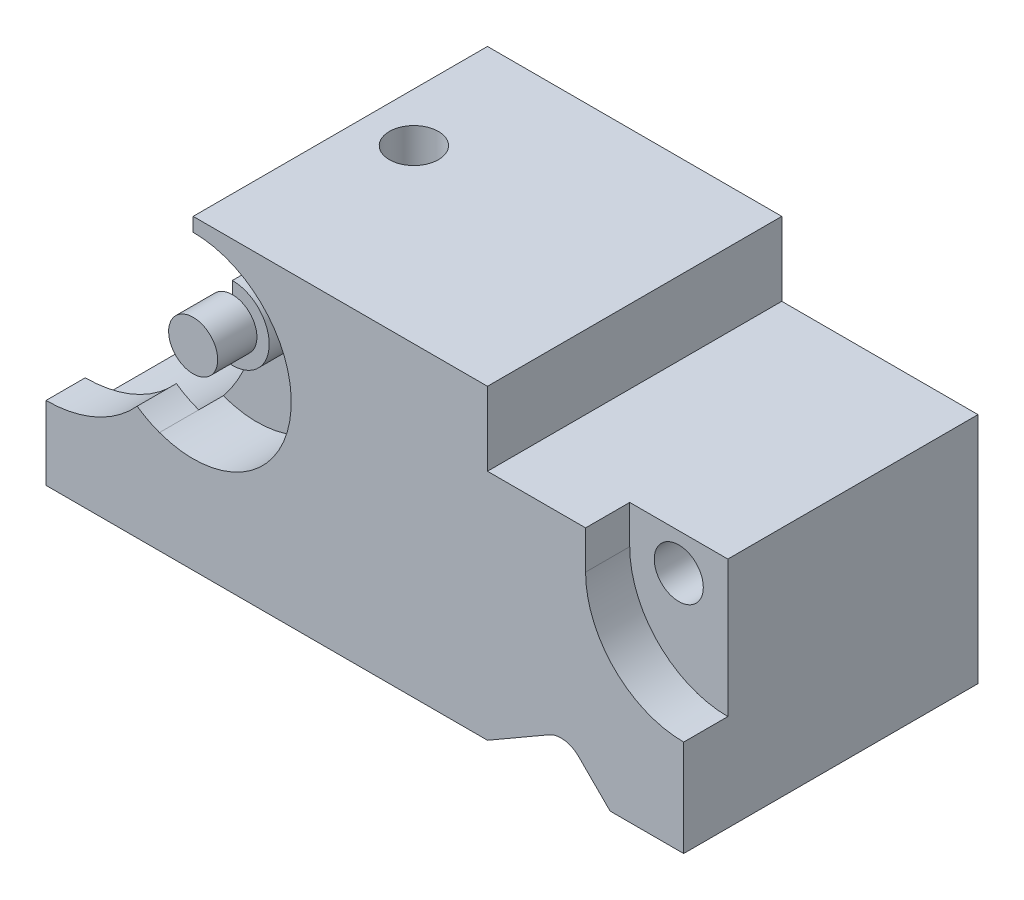
ISO-10303-21;
HEADER;
FILE_DESCRIPTION(('STEP AP214'),'2;1');
FILE_NAME('part.step','',(''),(''),'','','');
FILE_SCHEMA(('AUTOMOTIVE_DESIGN { 1 0 10303 214 1 1 1 1 }'));
ENDSEC;
DATA;
#1=APPLICATION_CONTEXT('core data for automotive mechanical design processes');
#2=APPLICATION_PROTOCOL_DEFINITION('international standard','automotive_design',2000,#1);
#3=PRODUCT_CONTEXT('',#1,'mechanical');
#4=PRODUCT('Part','Part','',(#3));
#5=PRODUCT_RELATED_PRODUCT_CATEGORY('part','',(#4));
#6=PRODUCT_DEFINITION_FORMATION('','',#4);
#7=PRODUCT_DEFINITION_CONTEXT('part definition',#1,'design');
#8=PRODUCT_DEFINITION('design','',#6,#7);
#9=PRODUCT_DEFINITION_SHAPE('','',#8);
#10=(LENGTH_UNIT() NAMED_UNIT(*) SI_UNIT(.MILLI.,.METRE.));
#11=(NAMED_UNIT(*) PLANE_ANGLE_UNIT() SI_UNIT($,.RADIAN.));
#12=(NAMED_UNIT(*) SI_UNIT($,.STERADIAN.) SOLID_ANGLE_UNIT());
#13=UNCERTAINTY_MEASURE_WITH_UNIT(LENGTH_MEASURE(1.E-05),#10,'distance_accuracy_value','');
#14=(GEOMETRIC_REPRESENTATION_CONTEXT(3) GLOBAL_UNCERTAINTY_ASSIGNED_CONTEXT((#13)) GLOBAL_UNIT_ASSIGNED_CONTEXT((#10,
#11,#12)) REPRESENTATION_CONTEXT('',''));
#15=CARTESIAN_POINT('',(0.,0.,0.));
#16=DIRECTION('',(0.,0.,1.));
#17=DIRECTION('',(1.,0.,0.));
#18=AXIS2_PLACEMENT_3D('',#15,#16,#17);
#19=CARTESIAN_POINT('',(-65.,0.,-30.));
#20=DIRECTION('',(0.,-1.,0.));
#21=DIRECTION('',(1.,0.,0.));
#22=AXIS2_PLACEMENT_3D('',#19,#20,#21);
#23=PLANE('',#22);
#24=DIRECTION('',(0.,0.,1.));
#25=VECTOR('',#24,1.);
#26=CARTESIAN_POINT('',(25.,0.,-30.));
#27=LINE('',#26,#25);
#28=CARTESIAN_POINT('',(25.,0.,-30.));
#29=VERTEX_POINT('',#28);
#30=CARTESIAN_POINT('',(25.,0.,30.));
#31=VERTEX_POINT('',#30);
#32=EDGE_CURVE('E193',#29,#31,#27,.T.);
#33=ORIENTED_EDGE('',*,*,#32,.T.);
#34=DIRECTION('',(1.,0.,0.));
#35=VECTOR('',#34,1.);
#36=CARTESIAN_POINT('',(-65.,0.,30.));
#37=LINE('',#36,#35);
#38=CARTESIAN_POINT('',(-65.,0.,30.));
#39=VERTEX_POINT('',#38);
#40=EDGE_CURVE('E301',#39,#31,#37,.T.);
#41=ORIENTED_EDGE('',*,*,#40,.F.);
#42=DIRECTION('',(0.,0.,1.));
#43=VECTOR('',#42,1.);
#44=CARTESIAN_POINT('',(-65.,0.,-30.));
#45=LINE('',#44,#43);
#46=CARTESIAN_POINT('',(-65.,0.,-30.));
#47=VERTEX_POINT('',#46);
#48=EDGE_CURVE('E219',#47,#39,#45,.T.);
#49=ORIENTED_EDGE('',*,*,#48,.F.);
#50=DIRECTION('',(1.,0.,0.));
#51=VECTOR('',#50,1.);
#52=CARTESIAN_POINT('',(-65.,0.,-30.));
#53=LINE('',#52,#51);
#54=EDGE_CURVE('E211',#47,#29,#53,.T.);
#55=ORIENTED_EDGE('',*,*,#54,.T.);
#56=EDGE_LOOP('',(#33,#41,#49,#55));
#57=FACE_BOUND('',#56,.T.);
#58=CARTESIAN_POINT('',(-25.,0.,-5.));
#59=DIRECTION('',(0.,1.,0.));
#60=DIRECTION('',(-1.,0.,0.));
#61=AXIS2_PLACEMENT_3D('',#58,#59,#60);
#62=CIRCLE('',#61,5.);
#63=CARTESIAN_POINT('',(-30.,0.,-5.));
#64=VERTEX_POINT('',#63);
#65=EDGE_CURVE('E402',#64,#64,#62,.T.);
#66=ORIENTED_EDGE('',*,*,#65,.T.);
#67=EDGE_LOOP('',(#66));
#68=FACE_BOUND('',#67,.T.);
#69=ADVANCED_FACE('F33',(#57,#68),#23,.T.);
#70=CARTESIAN_POINT('',(-35.0000000000001,39.6862696659606,17.));
#71=DIRECTION('',(0.,0.,1.));
#72=DIRECTION('',(1.,0.,0.));
#73=AXIS2_PLACEMENT_3D('',#70,#71,#72);
#74=PLANE('',#73);
#75=CARTESIAN_POINT('',(-35.,39.6862696659606,17.));
#76=DIRECTION('',(0.,0.,1.));
#77=DIRECTION('',(1.,0.,0.));
#78=AXIS2_PLACEMENT_3D('',#75,#76,#77);
#79=CIRCLE('',#78,7.5);
#80=CARTESIAN_POINT('',(-35.9374999999997,32.2450941035914,17.));
#81=VERTEX_POINT('',#80);
#82=CARTESIAN_POINT('',(-35.,47.1862696659606,17.));
#83=VERTEX_POINT('',#82);
#84=EDGE_CURVE('E358',#81,#83,#79,.T.);
#85=ORIENTED_EDGE('',*,*,#84,.F.);
#86=CARTESIAN_POINT('',(-64.9999999999997,39.6862696659606,17.));
#87=DIRECTION('',(0.,0.,-1.));
#88=DIRECTION('',(1.,0.,0.));
#89=AXIS2_PLACEMENT_3D('',#86,#87,#88);
#90=CIRCLE('',#89,29.9999999999998);
#91=CARTESIAN_POINT('',(-35.,39.6862696659606,17.));
#92=VERTEX_POINT('',#91);
#93=EDGE_CURVE('E361',#92,#81,#90,.T.);
#94=ORIENTED_EDGE('',*,*,#93,.F.);
#95=CARTESIAN_POINT('',(-65.,40.,17.));
#96=DIRECTION('',(0.,0.,1.));
#97=DIRECTION('',(1.,0.,0.));
#98=AXIS2_PLACEMENT_3D('',#95,#96,#97);
#99=CIRCLE('',#98,30.0016404005263);
#100=CARTESIAN_POINT('',(-41.8631200890134,20.9007011985497,17.));
#101=VERTEX_POINT('',#100);
#102=EDGE_CURVE('E288',#101,#92,#99,.T.);
#103=ORIENTED_EDGE('',*,*,#102,.F.);
#104=CARTESIAN_POINT('',(-35.0000000000001,39.6862696659606,17.));
#105=DIRECTION('',(0.,0.,1.));
#106=DIRECTION('',(1.,0.,0.));
#107=AXIS2_PLACEMENT_3D('',#104,#105,#106);
#108=CIRCLE('',#107,20.);
#109=CARTESIAN_POINT('',(-35.0000000000001,59.6862696659606,17.));
#110=VERTEX_POINT('',#109);
#111=EDGE_CURVE('E284',#101,#110,#108,.T.);
#112=ORIENTED_EDGE('',*,*,#111,.T.);
#113=DIRECTION('',(0.,1.,0.));
#114=VECTOR('',#113,1.);
#115=CARTESIAN_POINT('',(-35.,62.5,17.));
#116=LINE('',#115,#114);
#117=EDGE_CURVE('E41',#83,#110,#116,.T.);
#118=ORIENTED_EDGE('',*,*,#117,.F.);
#119=EDGE_LOOP('',(#85,#94,#103,#112,#118));
#120=FACE_BOUND('',#119,.T.);
#121=ADVANCED_FACE('F285',(#120),#74,.T.);
#122=DIRECTION('',(0.,0.,1.));
#123=VECTOR('',#122,1.);
#124=CARTESIAN_POINT('',(50.,0.,-30.));
#125=LINE('',#124,#123);
#126=CARTESIAN_POINT('',(50.,0.,-30.));
#127=VERTEX_POINT('',#126);
#128=CARTESIAN_POINT('',(50.,0.,30.));
#129=VERTEX_POINT('',#128);
#130=EDGE_CURVE('E48',#127,#129,#125,.T.);
#131=ORIENTED_EDGE('',*,*,#130,.F.);
#132=CARTESIAN_POINT('',(65.,0.,-30.));
#133=VERTEX_POINT('',#132);
#134=EDGE_CURVE('E221',#127,#133,#53,.T.);
#135=ORIENTED_EDGE('',*,*,#134,.T.);
#136=DIRECTION('',(0.,0.,1.));
#137=VECTOR('',#136,1.);
#138=CARTESIAN_POINT('',(65.,0.,-30.));
#139=LINE('',#138,#137);
#140=CARTESIAN_POINT('',(65.,0.,30.));
#141=VERTEX_POINT('',#140);
#142=EDGE_CURVE('E246',#133,#141,#139,.T.);
#143=ORIENTED_EDGE('',*,*,#142,.T.);
#144=EDGE_CURVE('E300',#129,#141,#37,.T.);
#145=ORIENTED_EDGE('',*,*,#144,.F.);
#146=EDGE_LOOP('',(#131,#135,#143,#145));
#147=FACE_BOUND('',#146,.T.);
#148=ADVANCED_FACE('F35',(#147),#23,.T.);
#149=CARTESIAN_POINT('',(-65.,9.99835959947371,-30.));
#150=DIRECTION('',(-1.,0.,0.));
#151=DIRECTION('',(0.,0.,1.));
#152=AXIS2_PLACEMENT_3D('',#149,#150,#151);
#153=PLANE('',#152);
#154=ORIENTED_EDGE('',*,*,#48,.T.);
#155=DIRECTION('',(0.,-1.,0.));
#156=VECTOR('',#155,1.);
#157=CARTESIAN_POINT('',(-65.,9.99835959947371,30.));
#158=LINE('',#157,#156);
#159=CARTESIAN_POINT('',(-64.9999999999997,15.,30.));
#160=VERTEX_POINT('',#159);
#161=EDGE_CURVE('E226',#160,#39,#158,.T.);
#162=ORIENTED_EDGE('',*,*,#161,.F.);
#163=DIRECTION('',(0.,0.,1.));
#164=VECTOR('',#163,1.);
#165=CARTESIAN_POINT('',(-64.9999999999997,15.,22.));
#166=LINE('',#165,#164);
#167=CARTESIAN_POINT('',(-64.9999999999997,15.,22.));
#168=VERTEX_POINT('',#167);
#169=EDGE_CURVE('E328',#168,#160,#166,.T.);
#170=ORIENTED_EDGE('',*,*,#169,.F.);
#171=DIRECTION('',(0.,-1.,0.));
#172=VECTOR('',#171,1.);
#173=CARTESIAN_POINT('',(-65.,9.99835959947371,22.));
#174=LINE('',#173,#172);
#175=CARTESIAN_POINT('',(-65.,9.99835959947371,22.));
#176=VERTEX_POINT('',#175);
#177=EDGE_CURVE('E348',#168,#176,#174,.T.);
#178=ORIENTED_EDGE('',*,*,#177,.T.);
#179=DIRECTION('',(0.,0.,1.));
#180=VECTOR('',#179,1.);
#181=CARTESIAN_POINT('',(-65.,9.99835959947371,-30.));
#182=LINE('',#181,#180);
#183=CARTESIAN_POINT('',(-65.,9.99835959947371,-30.));
#184=VERTEX_POINT('',#183);
#185=EDGE_CURVE('E249',#184,#176,#182,.T.);
#186=ORIENTED_EDGE('',*,*,#185,.F.);
#187=DIRECTION('',(0.,-1.,0.));
#188=VECTOR('',#187,1.);
#189=CARTESIAN_POINT('',(-65.,9.99835959947371,-30.));
#190=LINE('',#189,#188);
#191=EDGE_CURVE('E244',#184,#47,#190,.T.);
#192=ORIENTED_EDGE('',*,*,#191,.T.);
#193=EDGE_LOOP('',(#154,#162,#170,#178,#186,#192));
#194=FACE_BOUND('',#193,.T.);
#195=ADVANCED_FACE('F327',(#194),#153,.T.);
#196=CARTESIAN_POINT('',(-65.,40.,-30.));
#197=DIRECTION('',(0.,0.,1.));
#198=DIRECTION('',(1.,0.,0.));
#199=AXIS2_PLACEMENT_3D('',#196,#197,#198);
#200=CYLINDRICAL_SURFACE('',#199,30.0016404005263);
#201=DIRECTION('',(0.,0.,1.));
#202=VECTOR('',#201,1.);
#203=CARTESIAN_POINT('',(-41.8634892542629,20.9002540007757,22.));
#204=LINE('',#203,#202);
#205=CARTESIAN_POINT('',(-41.8634892542629,20.9002540007757,22.));
#206=VERTEX_POINT('',#205);
#207=CARTESIAN_POINT('',(-41.8634892542629,20.9002540007757,30.));
#208=VERTEX_POINT('',#207);
#209=EDGE_CURVE('E291',#206,#208,#204,.T.);
#210=ORIENTED_EDGE('',*,*,#209,.T.);
#211=CARTESIAN_POINT('',(-65.,40.,30.));
#212=DIRECTION('',(0.,0.,-1.));
#213=DIRECTION('',(-1.,0.,0.));
#214=AXIS2_PLACEMENT_3D('',#211,#212,#213);
#215=CIRCLE('',#214,30.0016404005263);
#216=CARTESIAN_POINT('',(-41.8631200890134,20.9007011985497,30.));
#217=VERTEX_POINT('',#216);
#218=EDGE_CURVE('E315',#217,#208,#215,.T.);
#219=ORIENTED_EDGE('',*,*,#218,.F.);
#220=DIRECTION('',(0.,0.,1.));
#221=VECTOR('',#220,1.);
#222=CARTESIAN_POINT('',(-41.8631200890134,20.9007011985497,23.5));
#223=LINE('',#222,#221);
#224=EDGE_CURVE('E294',#101,#217,#223,.T.);
#225=ORIENTED_EDGE('',*,*,#224,.F.);
#226=ORIENTED_EDGE('',*,*,#102,.T.);
#227=DIRECTION('',(0.,0.,1.));
#228=VECTOR('',#227,1.);
#229=CARTESIAN_POINT('',(-35.0000000000001,39.6862696659606,-30.));
#230=LINE('',#229,#228);
#231=CARTESIAN_POINT('',(-35.0000000000001,39.6862696659606,-30.));
#232=VERTEX_POINT('',#231);
#233=EDGE_CURVE('E252',#232,#92,#230,.T.);
#234=ORIENTED_EDGE('',*,*,#233,.F.);
#235=CARTESIAN_POINT('',(-65.,40.,-30.));
#236=DIRECTION('',(0.,0.,-1.));
#237=DIRECTION('',(-1.,0.,0.));
#238=AXIS2_PLACEMENT_3D('',#235,#236,#237);
#239=CIRCLE('',#238,30.0016404005263);
#240=EDGE_CURVE('E241',#232,#184,#239,.T.);
#241=ORIENTED_EDGE('',*,*,#240,.T.);
#242=ORIENTED_EDGE('',*,*,#185,.T.);
#243=CARTESIAN_POINT('',(-65.,40.,22.));
#244=DIRECTION('',(0.,0.,1.));
#245=DIRECTION('',(1.,0.,0.));
#246=AXIS2_PLACEMENT_3D('',#243,#244,#245);
#247=CIRCLE('',#246,30.0016404005263);
#248=EDGE_CURVE('E339',#176,#206,#247,.T.);
#249=ORIENTED_EDGE('',*,*,#248,.T.);
#250=EDGE_LOOP('',(#210,#219,#225,#226,#234,#241,#242,#249));
#251=FACE_BOUND('',#250,.T.);
#252=ADVANCED_FACE('F450',(#251),#200,.F.);
#253=CARTESIAN_POINT('',(-35.,62.5,-30.));
#254=DIRECTION('',(-1.,0.,0.));
#255=DIRECTION('',(0.,0.,1.));
#256=AXIS2_PLACEMENT_3D('',#253,#254,#255);
#257=PLANE('',#256);
#258=DIRECTION('',(0.,0.,1.));
#259=VECTOR('',#258,1.);
#260=CARTESIAN_POINT('',(-35.0000000000001,59.6862696659606,17.));
#261=LINE('',#260,#259);
#262=CARTESIAN_POINT('',(-35.0000000000001,59.6862696659606,30.));
#263=VERTEX_POINT('',#262);
#264=EDGE_CURVE('E275',#110,#263,#261,.T.);
#265=ORIENTED_EDGE('',*,*,#264,.T.);
#266=DIRECTION('',(0.,-1.,0.));
#267=VECTOR('',#266,1.);
#268=CARTESIAN_POINT('',(-35.,62.5,30.));
#269=LINE('',#268,#267);
#270=CARTESIAN_POINT('',(-35.,62.5,30.));
#271=VERTEX_POINT('',#270);
#272=EDGE_CURVE('E314',#271,#263,#269,.T.);
#273=ORIENTED_EDGE('',*,*,#272,.F.);
#274=DIRECTION('',(0.,0.,1.));
#275=VECTOR('',#274,1.);
#276=CARTESIAN_POINT('',(-35.,62.5,-30.));
#277=LINE('',#276,#275);
#278=CARTESIAN_POINT('',(-35.,62.5,-30.));
#279=VERTEX_POINT('',#278);
#280=EDGE_CURVE('E255',#279,#271,#277,.T.);
#281=ORIENTED_EDGE('',*,*,#280,.F.);
#282=DIRECTION('',(0.,-1.,0.));
#283=VECTOR('',#282,1.);
#284=CARTESIAN_POINT('',(-35.,62.5,-30.));
#285=LINE('',#284,#283);
#286=EDGE_CURVE('E238',#279,#232,#285,.T.);
#287=ORIENTED_EDGE('',*,*,#286,.T.);
#288=ORIENTED_EDGE('',*,*,#233,.T.);
#289=DIRECTION('',(0.,0.,-1.));
#290=VECTOR('',#289,1.);
#291=CARTESIAN_POINT('',(-35.,39.6862696659606,22.));
#292=LINE('',#291,#290);
#293=CARTESIAN_POINT('',(-34.9999999999999,39.6862696659606,22.));
#294=VERTEX_POINT('',#293);
#295=EDGE_CURVE('E355',#294,#92,#292,.T.);
#296=ORIENTED_EDGE('',*,*,#295,.F.);
#297=DIRECTION('',(0.,-1.,0.));
#298=VECTOR('',#297,1.);
#299=CARTESIAN_POINT('',(-35.,47.1862696659606,22.));
#300=LINE('',#299,#298);
#301=CARTESIAN_POINT('',(-35.,44.6862696659606,22.));
#302=VERTEX_POINT('',#301);
#303=EDGE_CURVE('E367',#302,#294,#300,.T.);
#304=ORIENTED_EDGE('',*,*,#303,.F.);
#305=CARTESIAN_POINT('',(-35.,47.1862696659606,22.));
#306=VERTEX_POINT('',#305);
#307=EDGE_CURVE('E357',#306,#302,#300,.T.);
#308=ORIENTED_EDGE('',*,*,#307,.F.);
#309=DIRECTION('',(0.,0.,-1.));
#310=VECTOR('',#309,1.);
#311=CARTESIAN_POINT('',(-35.,47.1862696659606,22.));
#312=LINE('',#311,#310);
#313=EDGE_CURVE('E279',#306,#83,#312,.T.);
#314=ORIENTED_EDGE('',*,*,#313,.T.);
#315=ORIENTED_EDGE('',*,*,#117,.T.);
#316=EDGE_LOOP('',(#265,#273,#281,#287,#288,#296,#304,#308,#314,#315));
#317=FACE_BOUND('',#316,.T.);
#318=ADVANCED_FACE('F272',(#317),#257,.T.);
#319=CARTESIAN_POINT('',(25.,62.5,-30.));
#320=DIRECTION('',(0.,1.,0.));
#321=DIRECTION('',(-1.,0.,0.));
#322=AXIS2_PLACEMENT_3D('',#319,#320,#321);
#323=PLANE('',#322);
#324=CARTESIAN_POINT('',(-25.,62.5,-5.));
#325=DIRECTION('',(0.,1.,0.));
#326=DIRECTION('',(-1.,0.,0.));
#327=AXIS2_PLACEMENT_3D('',#324,#325,#326);
#328=CIRCLE('',#327,5.);
#329=CARTESIAN_POINT('',(-30.,62.5,-5.));
#330=VERTEX_POINT('',#329);
#331=EDGE_CURVE('E405',#330,#330,#328,.T.);
#332=ORIENTED_EDGE('',*,*,#331,.F.);
#333=EDGE_LOOP('',(#332));
#334=FACE_BOUND('',#333,.T.);
#335=ORIENTED_EDGE('',*,*,#280,.T.);
#336=DIRECTION('',(-1.,0.,0.));
#337=VECTOR('',#336,1.);
#338=CARTESIAN_POINT('',(25.,62.5,30.));
#339=LINE('',#338,#337);
#340=CARTESIAN_POINT('',(25.,62.5,30.));
#341=VERTEX_POINT('',#340);
#342=EDGE_CURVE('E311',#341,#271,#339,.T.);
#343=ORIENTED_EDGE('',*,*,#342,.F.);
#344=DIRECTION('',(0.,0.,1.));
#345=VECTOR('',#344,1.);
#346=CARTESIAN_POINT('',(25.,62.5,-30.));
#347=LINE('',#346,#345);
#348=CARTESIAN_POINT('',(25.,62.5,-30.));
#349=VERTEX_POINT('',#348);
#350=EDGE_CURVE('E257',#349,#341,#347,.T.);
#351=ORIENTED_EDGE('',*,*,#350,.F.);
#352=DIRECTION('',(-1.,0.,0.));
#353=VECTOR('',#352,1.);
#354=CARTESIAN_POINT('',(25.,62.5,-30.));
#355=LINE('',#354,#353);
#356=EDGE_CURVE('E235',#349,#279,#355,.T.);
#357=ORIENTED_EDGE('',*,*,#356,.T.);
#358=EDGE_LOOP('',(#335,#343,#351,#357));
#359=FACE_BOUND('',#358,.T.);
#360=ADVANCED_FACE('F462',(#334,#359),#323,.T.);
#361=CARTESIAN_POINT('',(25.,47.5,-30.));
#362=DIRECTION('',(1.,0.,0.));
#363=DIRECTION('',(0.,0.,-1.));
#364=AXIS2_PLACEMENT_3D('',#361,#362,#363);
#365=PLANE('',#364);
#366=ORIENTED_EDGE('',*,*,#350,.T.);
#367=DIRECTION('',(0.,1.,0.));
#368=VECTOR('',#367,1.);
#369=CARTESIAN_POINT('',(25.,47.5,30.));
#370=LINE('',#369,#368);
#371=CARTESIAN_POINT('',(25.,47.5,30.));
#372=VERTEX_POINT('',#371);
#373=EDGE_CURVE('E308',#372,#341,#370,.T.);
#374=ORIENTED_EDGE('',*,*,#373,.F.);
#375=DIRECTION('',(0.,0.,1.));
#376=VECTOR('',#375,1.);
#377=CARTESIAN_POINT('',(25.,47.5,-30.));
#378=LINE('',#377,#376);
#379=CARTESIAN_POINT('',(25.,47.5,-30.));
#380=VERTEX_POINT('',#379);
#381=EDGE_CURVE('E259',#380,#372,#378,.T.);
#382=ORIENTED_EDGE('',*,*,#381,.F.);
#383=DIRECTION('',(0.,1.,0.));
#384=VECTOR('',#383,1.);
#385=CARTESIAN_POINT('',(25.,47.5,-30.));
#386=LINE('',#385,#384);
#387=EDGE_CURVE('E232',#380,#349,#386,.T.);
#388=ORIENTED_EDGE('',*,*,#387,.T.);
#389=EDGE_LOOP('',(#366,#374,#382,#388));
#390=FACE_BOUND('',#389,.T.);
#391=ADVANCED_FACE('F465',(#390),#365,.T.);
#392=CARTESIAN_POINT('',(65.,47.5,-30.));
#393=DIRECTION('',(0.,1.,0.));
#394=DIRECTION('',(-1.,0.,0.));
#395=AXIS2_PLACEMENT_3D('',#392,#393,#394);
#396=PLANE('',#395);
#397=DIRECTION('',(0.,0.,1.));
#398=VECTOR('',#397,1.);
#399=CARTESIAN_POINT('',(45.,47.5,21.));
#400=LINE('',#399,#398);
#401=CARTESIAN_POINT('',(45.,47.5,21.));
#402=VERTEX_POINT('',#401);
#403=CARTESIAN_POINT('',(45.,47.5,30.));
#404=VERTEX_POINT('',#403);
#405=EDGE_CURVE('E56',#402,#404,#400,.T.);
#406=ORIENTED_EDGE('',*,*,#405,.F.);
#407=DIRECTION('',(-1.,0.,0.));
#408=VECTOR('',#407,1.);
#409=CARTESIAN_POINT('',(65.,47.5,21.));
#410=LINE('',#409,#408);
#411=CARTESIAN_POINT('',(65.,47.5,21.));
#412=VERTEX_POINT('',#411);
#413=EDGE_CURVE('E395',#412,#402,#410,.T.);
#414=ORIENTED_EDGE('',*,*,#413,.F.);
#415=DIRECTION('',(0.,0.,1.));
#416=VECTOR('',#415,1.);
#417=CARTESIAN_POINT('',(65.,47.5,-30.));
#418=LINE('',#417,#416);
#419=CARTESIAN_POINT('',(65.,47.5,-30.));
#420=VERTEX_POINT('',#419);
#421=EDGE_CURVE('E262',#420,#412,#418,.T.);
#422=ORIENTED_EDGE('',*,*,#421,.F.);
#423=DIRECTION('',(-1.,0.,0.));
#424=VECTOR('',#423,1.);
#425=CARTESIAN_POINT('',(65.,47.5,-30.));
#426=LINE('',#425,#424);
#427=EDGE_CURVE('E224',#420,#380,#426,.T.);
#428=ORIENTED_EDGE('',*,*,#427,.T.);
#429=ORIENTED_EDGE('',*,*,#381,.T.);
#430=DIRECTION('',(-1.,0.,0.));
#431=VECTOR('',#430,1.);
#432=CARTESIAN_POINT('',(65.,47.5,30.));
#433=LINE('',#432,#431);
#434=EDGE_CURVE('E306',#404,#372,#433,.T.);
#435=ORIENTED_EDGE('',*,*,#434,.F.);
#436=EDGE_LOOP('',(#406,#414,#422,#428,#429,#435));
#437=FACE_BOUND('',#436,.T.);
#438=ADVANCED_FACE('F469',(#437),#396,.T.);
#439=CARTESIAN_POINT('',(65.,0.,-30.));
#440=DIRECTION('',(1.,0.,0.));
#441=DIRECTION('',(0.,0.,-1.));
#442=AXIS2_PLACEMENT_3D('',#439,#440,#441);
#443=PLANE('',#442);
#444=DIRECTION('',(0.,0.,1.));
#445=VECTOR('',#444,1.);
#446=CARTESIAN_POINT('',(65.,19.6862696659606,21.));
#447=LINE('',#446,#445);
#448=CARTESIAN_POINT('',(65.,19.6862696659606,21.));
#449=VERTEX_POINT('',#448);
#450=CARTESIAN_POINT('',(65.,19.6862696659606,30.));
#451=VERTEX_POINT('',#450);
#452=EDGE_CURVE('E375',#449,#451,#447,.T.);
#453=ORIENTED_EDGE('',*,*,#452,.T.);
#454=DIRECTION('',(0.,1.,0.));
#455=VECTOR('',#454,1.);
#456=CARTESIAN_POINT('',(65.,0.,30.));
#457=LINE('',#456,#455);
#458=EDGE_CURVE('E303',#141,#451,#457,.T.);
#459=ORIENTED_EDGE('',*,*,#458,.F.);
#460=ORIENTED_EDGE('',*,*,#142,.F.);
#461=DIRECTION('',(0.,1.,0.));
#462=VECTOR('',#461,1.);
#463=CARTESIAN_POINT('',(65.,0.,-30.));
#464=LINE('',#463,#462);
#465=EDGE_CURVE('E220',#133,#420,#464,.T.);
#466=ORIENTED_EDGE('',*,*,#465,.T.);
#467=ORIENTED_EDGE('',*,*,#421,.T.);
#468=DIRECTION('',(0.,1.,0.));
#469=VECTOR('',#468,1.);
#470=CARTESIAN_POINT('',(65.,47.5,21.));
#471=LINE('',#470,#469);
#472=EDGE_CURVE('E386',#449,#412,#471,.T.);
#473=ORIENTED_EDGE('',*,*,#472,.F.);
#474=EDGE_LOOP('',(#453,#459,#460,#466,#467,#473));
#475=FACE_BOUND('',#474,.T.);
#476=ADVANCED_FACE('F472',(#475),#443,.T.);
#477=CARTESIAN_POINT('',(-65.,40.,-30.));
#478=DIRECTION('',(0.,0.,-1.));
#479=DIRECTION('',(-1.,0.,0.));
#480=AXIS2_PLACEMENT_3D('',#477,#478,#479);
#481=PLANE('',#480);
#482=DIRECTION('',(-0.866025403784438,-0.500000000000001,0.));
#483=VECTOR('',#482,1.);
#484=CARTESIAN_POINT('',(25.,0.,-30.));
#485=LINE('',#484,#483);
#486=CARTESIAN_POINT('',(37.5267415823931,7.23231762466356,-30.));
#487=VERTEX_POINT('',#486);
#488=EDGE_CURVE('E196',#487,#29,#485,.T.);
#489=ORIENTED_EDGE('',*,*,#488,.T.);
#490=ORIENTED_EDGE('',*,*,#54,.F.);
#491=ORIENTED_EDGE('',*,*,#191,.F.);
#492=ORIENTED_EDGE('',*,*,#240,.F.);
#493=ORIENTED_EDGE('',*,*,#286,.F.);
#494=ORIENTED_EDGE('',*,*,#356,.F.);
#495=ORIENTED_EDGE('',*,*,#387,.F.);
#496=ORIENTED_EDGE('',*,*,#427,.F.);
#497=ORIENTED_EDGE('',*,*,#465,.F.);
#498=ORIENTED_EDGE('',*,*,#134,.F.);
#499=DIRECTION('',(-0.707106781186546,0.707106781186549,0.));
#500=VECTOR('',#499,1.);
#501=CARTESIAN_POINT('',(43.5622754883259,6.4377245116741,-30.));
#502=LINE('',#501,#500);
#503=CARTESIAN_POINT('',(43.5622754883259,6.4377245116741,-30.));
#504=VERTEX_POINT('',#503);
#505=EDGE_CURVE('E215',#127,#504,#502,.T.);
#506=ORIENTED_EDGE('',*,*,#505,.T.);
#507=CARTESIAN_POINT('',(40.0267415823931,2.90219060574139,-30.));
#508=DIRECTION('',(0.,0.,1.));
#509=DIRECTION('',(1.,0.,0.));
#510=AXIS2_PLACEMENT_3D('',#507,#508,#509);
#511=CIRCLE('',#510,5.);
#512=EDGE_CURVE('E204',#504,#487,#511,.T.);
#513=ORIENTED_EDGE('',*,*,#512,.T.);
#514=EDGE_LOOP('',(#489,#490,#491,#492,#493,#494,#495,#496,#497,#498,#506,#513));
#515=FACE_BOUND('',#514,.T.);
#516=CARTESIAN_POINT('',(55.,40.,-30.));
#517=DIRECTION('',(0.,0.,1.));
#518=DIRECTION('',(1.,0.,0.));
#519=AXIS2_PLACEMENT_3D('',#516,#517,#518);
#520=CIRCLE('',#519,5.);
#521=CARTESIAN_POINT('',(60.,40.,-30.));
#522=VERTEX_POINT('',#521);
#523=EDGE_CURVE('E389',#522,#522,#520,.T.);
#524=ORIENTED_EDGE('',*,*,#523,.T.);
#525=EDGE_LOOP('',(#524));
#526=FACE_BOUND('',#525,.T.);
#527=ADVANCED_FACE('F208',(#515,#526),#481,.T.);
#528=CARTESIAN_POINT('',(-65.,40.,30.));
#529=DIRECTION('',(0.,0.,-1.));
#530=DIRECTION('',(-1.,0.,0.));
#531=AXIS2_PLACEMENT_3D('',#528,#529,#530);
#532=PLANE('',#531);
#533=ORIENTED_EDGE('',*,*,#40,.T.);
#534=DIRECTION('',(-0.866025403784438,-0.500000000000001,0.));
#535=VECTOR('',#534,1.);
#536=CARTESIAN_POINT('',(25.,0.,30.));
#537=LINE('',#536,#535);
#538=CARTESIAN_POINT('',(37.5267415823931,7.23231762466356,30.));
#539=VERTEX_POINT('',#538);
#540=EDGE_CURVE('E199',#539,#31,#537,.T.);
#541=ORIENTED_EDGE('',*,*,#540,.F.);
#542=CARTESIAN_POINT('',(40.0267415823931,2.90219060574139,30.));
#543=DIRECTION('',(0.,0.,1.));
#544=DIRECTION('',(1.,0.,0.));
#545=AXIS2_PLACEMENT_3D('',#542,#543,#544);
#546=CIRCLE('',#545,5.);
#547=CARTESIAN_POINT('',(43.5622754883259,6.4377245116741,30.));
#548=VERTEX_POINT('',#547);
#549=EDGE_CURVE('E216',#548,#539,#546,.T.);
#550=ORIENTED_EDGE('',*,*,#549,.F.);
#551=DIRECTION('',(-0.707106781186546,0.707106781186549,0.));
#552=VECTOR('',#551,1.);
#553=CARTESIAN_POINT('',(43.5622754883259,6.4377245116741,30.));
#554=LINE('',#553,#552);
#555=EDGE_CURVE('E417',#129,#548,#554,.T.);
#556=ORIENTED_EDGE('',*,*,#555,.F.);
#557=ORIENTED_EDGE('',*,*,#144,.T.);
#558=ORIENTED_EDGE('',*,*,#458,.T.);
#559=CARTESIAN_POINT('',(65.,39.6862696659606,30.));
#560=DIRECTION('',(0.,0.,1.));
#561=DIRECTION('',(1.,0.,0.));
#562=AXIS2_PLACEMENT_3D('',#559,#560,#561);
#563=CIRCLE('',#562,20.);
#564=CARTESIAN_POINT('',(45.,39.6862696659606,30.));
#565=VERTEX_POINT('',#564);
#566=EDGE_CURVE('E384',#565,#451,#563,.T.);
#567=ORIENTED_EDGE('',*,*,#566,.F.);
#568=DIRECTION('',(0.,-1.,0.));
#569=VECTOR('',#568,1.);
#570=CARTESIAN_POINT('',(45.,47.5,30.));
#571=LINE('',#570,#569);
#572=EDGE_CURVE('E387',#404,#565,#571,.T.);
#573=ORIENTED_EDGE('',*,*,#572,.F.);
#574=ORIENTED_EDGE('',*,*,#434,.T.);
#575=ORIENTED_EDGE('',*,*,#373,.T.);
#576=ORIENTED_EDGE('',*,*,#342,.T.);
#577=ORIENTED_EDGE('',*,*,#272,.T.);
#578=CARTESIAN_POINT('',(-35.0000000000001,39.6862696659606,30.));
#579=DIRECTION('',(0.,0.,-1.));
#580=DIRECTION('',(-1.,0.,0.));
#581=AXIS2_PLACEMENT_3D('',#578,#579,#580);
#582=CIRCLE('',#581,20.);
#583=EDGE_CURVE('E248',#263,#217,#582,.T.);
#584=ORIENTED_EDGE('',*,*,#583,.T.);
#585=ORIENTED_EDGE('',*,*,#218,.T.);
#586=CARTESIAN_POINT('',(-35.,39.6862696659606,30.));
#587=DIRECTION('',(0.,0.,-1.));
#588=DIRECTION('',(1.,0.,0.));
#589=AXIS2_PLACEMENT_3D('',#586,#587,#588);
#590=CIRCLE('',#589,20.0005467254262);
#591=CARTESIAN_POINT('',(-46.4236896797121,23.2691693307127,30.));
#592=VERTEX_POINT('',#591);
#593=EDGE_CURVE('E343',#208,#592,#590,.T.);
#594=ORIENTED_EDGE('',*,*,#593,.T.);
#595=CARTESIAN_POINT('',(-65.,40.,30.));
#596=DIRECTION('',(0.,0.,-1.));
#597=DIRECTION('',(1.,0.,0.));
#598=AXIS2_PLACEMENT_3D('',#595,#596,#597);
#599=CIRCLE('',#598,25.);
#600=EDGE_CURVE('E324',#592,#160,#599,.T.);
#601=ORIENTED_EDGE('',*,*,#600,.T.);
#602=ORIENTED_EDGE('',*,*,#161,.T.);
#603=EDGE_LOOP('',(#533,#541,#550,#556,#557,#558,#567,#573,#574,#575,#576,#577,#584,#585,#594,
#601,#602));
#604=FACE_BOUND('',#603,.T.);
#605=ADVANCED_FACE('F322',(#604),#532,.F.);
#606=CARTESIAN_POINT('',(-35.0000000000001,39.6862696659606,17.));
#607=DIRECTION('',(0.,0.,1.));
#608=DIRECTION('',(1.,0.,0.));
#609=AXIS2_PLACEMENT_3D('',#606,#607,#608);
#610=CYLINDRICAL_SURFACE('',#609,20.);
#611=ORIENTED_EDGE('',*,*,#224,.T.);
#612=ORIENTED_EDGE('',*,*,#583,.F.);
#613=ORIENTED_EDGE('',*,*,#264,.F.);
#614=ORIENTED_EDGE('',*,*,#111,.F.);
#615=EDGE_LOOP('',(#611,#612,#613,#614));
#616=FACE_BOUND('',#615,.T.);
#617=ADVANCED_FACE('F293',(#616),#610,.F.);
#618=CARTESIAN_POINT('',(-35.,39.6862696659606,22.));
#619=DIRECTION('',(0.,0.,1.));
#620=DIRECTION('',(1.,0.,0.));
#621=AXIS2_PLACEMENT_3D('',#618,#619,#620);
#622=CYLINDRICAL_SURFACE('',#621,20.0005467254262);
#623=ORIENTED_EDGE('',*,*,#593,.F.);
#624=ORIENTED_EDGE('',*,*,#209,.F.);
#625=CARTESIAN_POINT('',(-35.,39.6862696659606,22.));
#626=DIRECTION('',(0.,0.,-1.));
#627=DIRECTION('',(1.,0.,0.));
#628=AXIS2_PLACEMENT_3D('',#625,#626,#627);
#629=CIRCLE('',#628,20.0005467254262);
#630=CARTESIAN_POINT('',(-46.4236896797121,23.2691693307127,22.));
#631=VERTEX_POINT('',#630);
#632=EDGE_CURVE('E342',#206,#631,#629,.T.);
#633=ORIENTED_EDGE('',*,*,#632,.T.);
#634=DIRECTION('',(0.,0.,1.));
#635=VECTOR('',#634,1.);
#636=CARTESIAN_POINT('',(-46.4236896797121,23.2691693307127,22.));
#637=LINE('',#636,#635);
#638=EDGE_CURVE('E335',#631,#592,#637,.T.);
#639=ORIENTED_EDGE('',*,*,#638,.T.);
#640=EDGE_LOOP('',(#623,#624,#633,#639));
#641=FACE_BOUND('',#640,.T.);
#642=ADVANCED_FACE('F537',(#641),#622,.F.);
#643=CARTESIAN_POINT('',(-65.,40.,22.));
#644=DIRECTION('',(0.,0.,1.));
#645=DIRECTION('',(1.,0.,0.));
#646=AXIS2_PLACEMENT_3D('',#643,#644,#645);
#647=CYLINDRICAL_SURFACE('',#646,25.);
#648=ORIENTED_EDGE('',*,*,#600,.F.);
#649=ORIENTED_EDGE('',*,*,#638,.F.);
#650=CARTESIAN_POINT('',(-65.,40.,22.));
#651=DIRECTION('',(0.,0.,-1.));
#652=DIRECTION('',(1.,0.,0.));
#653=AXIS2_PLACEMENT_3D('',#650,#651,#652);
#654=CIRCLE('',#653,25.);
#655=EDGE_CURVE('E334',#631,#168,#654,.T.);
#656=ORIENTED_EDGE('',*,*,#655,.T.);
#657=ORIENTED_EDGE('',*,*,#169,.T.);
#658=EDGE_LOOP('',(#648,#649,#656,#657));
#659=FACE_BOUND('',#658,.T.);
#660=ADVANCED_FACE('F332',(#659),#647,.F.);
#661=CARTESIAN_POINT('',(-35.,39.6862696659606,22.));
#662=DIRECTION('',(0.,0.,1.));
#663=DIRECTION('',(1.,0.,0.));
#664=AXIS2_PLACEMENT_3D('',#661,#662,#663);
#665=PLANE('',#664);
#666=ORIENTED_EDGE('',*,*,#632,.F.);
#667=ORIENTED_EDGE('',*,*,#248,.F.);
#668=ORIENTED_EDGE('',*,*,#177,.F.);
#669=ORIENTED_EDGE('',*,*,#655,.F.);
#670=EDGE_LOOP('',(#666,#667,#668,#669));
#671=FACE_BOUND('',#670,.T.);
#672=ADVANCED_FACE('F531',(#671),#665,.F.);
#673=CARTESIAN_POINT('',(-64.9999999999997,39.6862696659606,22.));
#674=DIRECTION('',(0.,0.,-1.));
#675=DIRECTION('',(-1.,0.,0.));
#676=AXIS2_PLACEMENT_3D('',#673,#674,#675);
#677=CYLINDRICAL_SURFACE('',#676,29.9999999999998);
#678=ORIENTED_EDGE('',*,*,#93,.T.);
#679=DIRECTION('',(0.,0.,-1.));
#680=VECTOR('',#679,1.);
#681=CARTESIAN_POINT('',(-35.9374999999997,32.2450941035914,22.));
#682=LINE('',#681,#680);
#683=CARTESIAN_POINT('',(-35.9374999999997,32.2450941035914,22.));
#684=VERTEX_POINT('',#683);
#685=EDGE_CURVE('E345',#684,#81,#682,.T.);
#686=ORIENTED_EDGE('',*,*,#685,.F.);
#687=CARTESIAN_POINT('',(-64.9999999999997,39.6862696659606,22.));
#688=DIRECTION('',(0.,0.,-1.));
#689=DIRECTION('',(1.,0.,0.));
#690=AXIS2_PLACEMENT_3D('',#687,#688,#689);
#691=CIRCLE('',#690,29.9999999999998);
#692=CARTESIAN_POINT('',(-35.4166666666665,34.7036610230016,22.));
#693=VERTEX_POINT('',#692);
#694=EDGE_CURVE('E360',#693,#684,#691,.T.);
#695=ORIENTED_EDGE('',*,*,#694,.F.);
#696=EDGE_CURVE('E370',#294,#693,#691,.T.);
#697=ORIENTED_EDGE('',*,*,#696,.F.);
#698=ORIENTED_EDGE('',*,*,#295,.T.);
#699=EDGE_LOOP('',(#678,#686,#695,#697,#698));
#700=FACE_BOUND('',#699,.T.);
#701=ADVANCED_FACE('F501',(#700),#677,.F.);
#702=CARTESIAN_POINT('',(-35.,39.6862696659606,22.));
#703=DIRECTION('',(0.,0.,-1.));
#704=DIRECTION('',(-1.,0.,0.));
#705=AXIS2_PLACEMENT_3D('',#702,#703,#704);
#706=CYLINDRICAL_SURFACE('',#705,7.5);
#707=ORIENTED_EDGE('',*,*,#84,.T.);
#708=ORIENTED_EDGE('',*,*,#313,.F.);
#709=CARTESIAN_POINT('',(-35.,39.6862696659606,22.));
#710=DIRECTION('',(0.,0.,1.));
#711=DIRECTION('',(1.,0.,0.));
#712=AXIS2_PLACEMENT_3D('',#709,#710,#711);
#713=CIRCLE('',#712,7.5);
#714=EDGE_CURVE('E368',#684,#306,#713,.T.);
#715=ORIENTED_EDGE('',*,*,#714,.F.);
#716=ORIENTED_EDGE('',*,*,#685,.T.);
#717=EDGE_LOOP('',(#707,#708,#715,#716));
#718=FACE_BOUND('',#717,.T.);
#719=ADVANCED_FACE('F521',(#718),#706,.T.);
#720=CARTESIAN_POINT('',(-64.9999999999997,39.6862696659606,22.));
#721=DIRECTION('',(0.,0.,1.));
#722=DIRECTION('',(1.,0.,0.));
#723=AXIS2_PLACEMENT_3D('',#720,#721,#722);
#724=PLANE('',#723);
#725=ORIENTED_EDGE('',*,*,#307,.T.);
#726=CARTESIAN_POINT('',(-35.,39.6862696659606,22.));
#727=DIRECTION('',(0.,0.,1.));
#728=DIRECTION('',(1.,0.,0.));
#729=AXIS2_PLACEMENT_3D('',#726,#727,#728);
#730=CIRCLE('',#729,5.);
#731=EDGE_CURVE('E11',#302,#693,#730,.F.);
#732=ORIENTED_EDGE('',*,*,#731,.T.);
#733=ORIENTED_EDGE('',*,*,#694,.T.);
#734=ORIENTED_EDGE('',*,*,#714,.T.);
#735=EDGE_LOOP('',(#725,#732,#733,#734));
#736=FACE_BOUND('',#735,.T.);
#737=ADVANCED_FACE('F507',(#736),#724,.T.);
#738=CARTESIAN_POINT('',(-35.,39.6862696659606,30.));
#739=DIRECTION('',(0.,0.,-1.));
#740=DIRECTION('',(-1.,0.,0.));
#741=AXIS2_PLACEMENT_3D('',#738,#739,#740);
#742=CYLINDRICAL_SURFACE('',#741,5.);
#743=CARTESIAN_POINT('',(-35.,39.6862696659606,30.));
#744=DIRECTION('',(0.,0.,1.));
#745=DIRECTION('',(1.,0.,0.));
#746=AXIS2_PLACEMENT_3D('',#743,#744,#745);
#747=CIRCLE('',#746,5.);
#748=CARTESIAN_POINT('',(-30.,39.6862696659606,30.));
#749=VERTEX_POINT('',#748);
#750=EDGE_CURVE('E364',#749,#749,#747,.T.);
#751=ORIENTED_EDGE('',*,*,#750,.F.);
#752=EDGE_LOOP('',(#751));
#753=FACE_BOUND('',#752,.T.);
#754=CARTESIAN_POINT('',(-35.,39.6862696659606,22.));
#755=DIRECTION('',(0.,0.,1.));
#756=DIRECTION('',(1.,0.,0.));
#757=AXIS2_PLACEMENT_3D('',#754,#755,#756);
#758=CIRCLE('',#757,5.);
#759=EDGE_CURVE('E373',#302,#693,#758,.T.);
#760=ORIENTED_EDGE('',*,*,#759,.T.);
#761=ORIENTED_EDGE('',*,*,#731,.F.);
#762=EDGE_LOOP('',(#760,#761));
#763=FACE_BOUND('',#762,.T.);
#764=ADVANCED_FACE('F510',(#753,#763),#742,.T.);
#765=CARTESIAN_POINT('',(-35.,39.6862696659606,30.));
#766=DIRECTION('',(0.,0.,1.));
#767=DIRECTION('',(1.,0.,0.));
#768=AXIS2_PLACEMENT_3D('',#765,#766,#767);
#769=PLANE('',#768);
#770=ORIENTED_EDGE('',*,*,#750,.T.);
#771=EDGE_LOOP('',(#770));
#772=FACE_BOUND('',#771,.T.);
#773=ADVANCED_FACE('F512',(#772),#769,.T.);
#774=CARTESIAN_POINT('',(-35.,39.6862696659606,22.));
#775=DIRECTION('',(0.,0.,1.));
#776=DIRECTION('',(1.,0.,0.));
#777=AXIS2_PLACEMENT_3D('',#774,#775,#776);
#778=PLANE('',#777);
#779=ORIENTED_EDGE('',*,*,#303,.T.);
#780=ORIENTED_EDGE('',*,*,#696,.T.);
#781=ORIENTED_EDGE('',*,*,#759,.F.);
#782=EDGE_LOOP('',(#779,#780,#781));
#783=FACE_BOUND('',#782,.T.);
#784=ADVANCED_FACE('F505',(#783),#778,.F.);
#785=CARTESIAN_POINT('',(65.,39.6862696659606,21.));
#786=DIRECTION('',(0.,0.,1.));
#787=DIRECTION('',(1.,0.,0.));
#788=AXIS2_PLACEMENT_3D('',#785,#786,#787);
#789=CYLINDRICAL_SURFACE('',#788,20.);
#790=ORIENTED_EDGE('',*,*,#566,.T.);
#791=ORIENTED_EDGE('',*,*,#452,.F.);
#792=CARTESIAN_POINT('',(65.,39.6862696659606,21.));
#793=DIRECTION('',(0.,0.,1.));
#794=DIRECTION('',(1.,0.,0.));
#795=AXIS2_PLACEMENT_3D('',#792,#793,#794);
#796=CIRCLE('',#795,20.);
#797=CARTESIAN_POINT('',(45.,39.6862696659606,21.));
#798=VERTEX_POINT('',#797);
#799=EDGE_CURVE('E380',#798,#449,#796,.T.);
#800=ORIENTED_EDGE('',*,*,#799,.F.);
#801=DIRECTION('',(0.,0.,1.));
#802=VECTOR('',#801,1.);
#803=CARTESIAN_POINT('',(45.,39.6862696659606,21.));
#804=LINE('',#803,#802);
#805=EDGE_CURVE('E379',#798,#565,#804,.T.);
#806=ORIENTED_EDGE('',*,*,#805,.T.);
#807=EDGE_LOOP('',(#790,#791,#800,#806));
#808=FACE_BOUND('',#807,.T.);
#809=ADVANCED_FACE('F482',(#808),#789,.F.);
#810=CARTESIAN_POINT('',(45.,47.5,21.));
#811=DIRECTION('',(-1.,0.,0.));
#812=DIRECTION('',(0.,0.,1.));
#813=AXIS2_PLACEMENT_3D('',#810,#811,#812);
#814=PLANE('',#813);
#815=ORIENTED_EDGE('',*,*,#572,.T.);
#816=ORIENTED_EDGE('',*,*,#805,.F.);
#817=DIRECTION('',(0.,-1.,0.));
#818=VECTOR('',#817,1.);
#819=CARTESIAN_POINT('',(45.,47.5,21.));
#820=LINE('',#819,#818);
#821=EDGE_CURVE('E392',#402,#798,#820,.T.);
#822=ORIENTED_EDGE('',*,*,#821,.F.);
#823=ORIENTED_EDGE('',*,*,#405,.T.);
#824=EDGE_LOOP('',(#815,#816,#822,#823));
#825=FACE_BOUND('',#824,.T.);
#826=ADVANCED_FACE('F486',(#825),#814,.F.);
#827=CARTESIAN_POINT('',(65.,39.6862696659606,21.));
#828=DIRECTION('',(0.,0.,1.));
#829=DIRECTION('',(1.,0.,0.));
#830=AXIS2_PLACEMENT_3D('',#827,#828,#829);
#831=PLANE('',#830);
#832=CARTESIAN_POINT('',(55.,40.,21.));
#833=DIRECTION('',(0.,0.,1.));
#834=DIRECTION('',(1.,0.,0.));
#835=AXIS2_PLACEMENT_3D('',#832,#833,#834);
#836=CIRCLE('',#835,5.);
#837=CARTESIAN_POINT('',(60.,40.,21.));
#838=VERTEX_POINT('',#837);
#839=EDGE_CURVE('E399',#838,#838,#836,.T.);
#840=ORIENTED_EDGE('',*,*,#839,.F.);
#841=EDGE_LOOP('',(#840));
#842=FACE_BOUND('',#841,.T.);
#843=ORIENTED_EDGE('',*,*,#472,.T.);
#844=ORIENTED_EDGE('',*,*,#413,.T.);
#845=ORIENTED_EDGE('',*,*,#821,.T.);
#846=ORIENTED_EDGE('',*,*,#799,.T.);
#847=EDGE_LOOP('',(#843,#844,#845,#846));
#848=FACE_BOUND('',#847,.T.);
#849=ADVANCED_FACE('F484',(#842,#848),#831,.T.);
#850=CARTESIAN_POINT('',(55.,40.,-30.));
#851=DIRECTION('',(0.,0.,1.));
#852=DIRECTION('',(1.,0.,0.));
#853=AXIS2_PLACEMENT_3D('',#850,#851,#852);
#854=CYLINDRICAL_SURFACE('',#853,5.);
#855=ORIENTED_EDGE('',*,*,#523,.F.);
#856=EDGE_LOOP('',(#855));
#857=FACE_BOUND('',#856,.T.);
#858=ORIENTED_EDGE('',*,*,#839,.T.);
#859=EDGE_LOOP('',(#858));
#860=FACE_BOUND('',#859,.T.);
#861=ADVANCED_FACE('F634',(#857,#860),#854,.F.);
#862=CARTESIAN_POINT('',(-25.,0.,-5.));
#863=DIRECTION('',(0.,1.,0.));
#864=DIRECTION('',(-1.,0.,0.));
#865=AXIS2_PLACEMENT_3D('',#862,#863,#864);
#866=CYLINDRICAL_SURFACE('',#865,5.);
#867=ORIENTED_EDGE('',*,*,#65,.F.);
#868=EDGE_LOOP('',(#867));
#869=FACE_BOUND('',#868,.T.);
#870=ORIENTED_EDGE('',*,*,#331,.T.);
#871=EDGE_LOOP('',(#870));
#872=FACE_BOUND('',#871,.T.);
#873=ADVANCED_FACE('F439',(#869,#872),#866,.F.);
#874=CARTESIAN_POINT('',(25.,0.,-30.));
#875=DIRECTION('',(-0.500000000000001,0.866025403784438,0.));
#876=DIRECTION('',(-0.866025403784438,-0.500000000000001,0.));
#877=AXIS2_PLACEMENT_3D('',#874,#875,#876);
#878=PLANE('',#877);
#879=ORIENTED_EDGE('',*,*,#540,.T.);
#880=ORIENTED_EDGE('',*,*,#32,.F.);
#881=ORIENTED_EDGE('',*,*,#488,.F.);
#882=DIRECTION('',(0.,0.,1.));
#883=VECTOR('',#882,1.);
#884=CARTESIAN_POINT('',(37.5267415823931,7.23231762466356,-30.));
#885=LINE('',#884,#883);
#886=EDGE_CURVE('E408',#487,#539,#885,.T.);
#887=ORIENTED_EDGE('',*,*,#886,.T.);
#888=EDGE_LOOP('',(#879,#880,#881,#887));
#889=FACE_BOUND('',#888,.T.);
#890=ADVANCED_FACE('F195',(#889),#878,.F.);
#891=CARTESIAN_POINT('',(40.0267415823931,2.90219060574139,-30.));
#892=DIRECTION('',(0.,0.,1.));
#893=DIRECTION('',(1.,0.,0.));
#894=AXIS2_PLACEMENT_3D('',#891,#892,#893);
#895=CYLINDRICAL_SURFACE('',#894,5.);
#896=ORIENTED_EDGE('',*,*,#549,.T.);
#897=ORIENTED_EDGE('',*,*,#886,.F.);
#898=ORIENTED_EDGE('',*,*,#512,.F.);
#899=DIRECTION('',(0.,0.,1.));
#900=VECTOR('',#899,1.);
#901=CARTESIAN_POINT('',(43.5622754883259,6.4377245116741,-30.));
#902=LINE('',#901,#900);
#903=EDGE_CURVE('E412',#504,#548,#902,.T.);
#904=ORIENTED_EDGE('',*,*,#903,.T.);
#905=EDGE_LOOP('',(#896,#897,#898,#904));
#906=FACE_BOUND('',#905,.T.);
#907=ADVANCED_FACE('F431',(#906),#895,.F.);
#908=CARTESIAN_POINT('',(43.5622754883259,6.4377245116741,-30.));
#909=DIRECTION('',(0.707106781186549,0.707106781186546,0.));
#910=DIRECTION('',(-0.707106781186546,0.707106781186549,0.));
#911=AXIS2_PLACEMENT_3D('',#908,#909,#910);
#912=PLANE('',#911);
#913=ORIENTED_EDGE('',*,*,#555,.T.);
#914=ORIENTED_EDGE('',*,*,#903,.F.);
#915=ORIENTED_EDGE('',*,*,#505,.F.);
#916=ORIENTED_EDGE('',*,*,#130,.T.);
#917=EDGE_LOOP('',(#913,#914,#915,#916));
#918=FACE_BOUND('',#917,.T.);
#919=ADVANCED_FACE('F423',(#918),#912,.F.);
#920=CLOSED_SHELL('',(#69,#121,#148,#195,#252,#318,#360,#391,#438,#476,#527,#605,#617,#642,#660,
#672,#701,#719,#737,#764,#773,#784,#809,#826,#849,#861,#873,#890,#907,#919));
#921=MANIFOLD_SOLID_BREP('B2',#920);
#922=ADVANCED_BREP_SHAPE_REPRESENTATION('',(#18,#921),#14);
#923=SHAPE_DEFINITION_REPRESENTATION(#9,#922);
ENDSEC;
END-ISO-10303-21;
